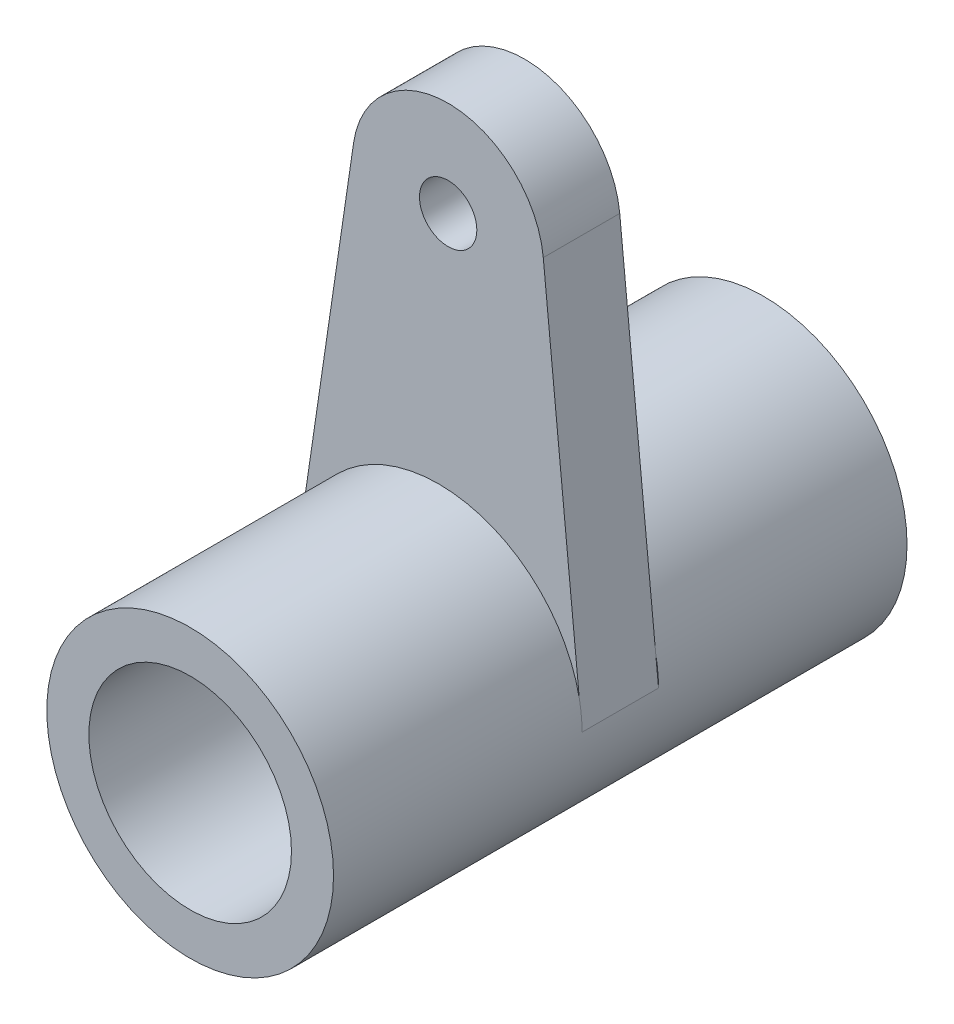
ISO-10303-21;
HEADER;
FILE_DESCRIPTION(('STEP AP214'),'2;1');
FILE_NAME('part.step','',(''),(''),'','','');
FILE_SCHEMA(('AUTOMOTIVE_DESIGN { 1 0 10303 214 1 1 1 1 }'));
ENDSEC;
DATA;
#1=APPLICATION_CONTEXT('core data for automotive mechanical design processes');
#2=APPLICATION_PROTOCOL_DEFINITION('international standard','automotive_design',2000,#1);
#3=PRODUCT_CONTEXT('',#1,'mechanical');
#4=PRODUCT('Part','Part','',(#3));
#5=PRODUCT_RELATED_PRODUCT_CATEGORY('part','',(#4));
#6=PRODUCT_DEFINITION_FORMATION('','',#4);
#7=PRODUCT_DEFINITION_CONTEXT('part definition',#1,'design');
#8=PRODUCT_DEFINITION('design','',#6,#7);
#9=PRODUCT_DEFINITION_SHAPE('','',#8);
#10=(LENGTH_UNIT() NAMED_UNIT(*) SI_UNIT(.MILLI.,.METRE.));
#11=(NAMED_UNIT(*) PLANE_ANGLE_UNIT() SI_UNIT($,.RADIAN.));
#12=(NAMED_UNIT(*) SI_UNIT($,.STERADIAN.) SOLID_ANGLE_UNIT());
#13=UNCERTAINTY_MEASURE_WITH_UNIT(LENGTH_MEASURE(1.E-05),#10,'distance_accuracy_value','');
#14=(GEOMETRIC_REPRESENTATION_CONTEXT(3) GLOBAL_UNCERTAINTY_ASSIGNED_CONTEXT((#13)) GLOBAL_UNIT_ASSIGNED_CONTEXT((#10,
#11,#12)) REPRESENTATION_CONTEXT('',''));
#15=CARTESIAN_POINT('',(0.,0.,0.));
#16=DIRECTION('',(0.,0.,1.));
#17=DIRECTION('',(1.,0.,0.));
#18=AXIS2_PLACEMENT_3D('',#15,#16,#17);
#19=CARTESIAN_POINT('',(0.495729812684115,19.9938553549038,-2.));
#20=DIRECTION('',(0.,0.,1.));
#21=DIRECTION('',(1.,0.,0.));
#22=AXIS2_PLACEMENT_3D('',#19,#20,#21);
#23=CYLINDRICAL_SURFACE('',#22,5.);
#24=DIRECTION('',(0.,0.,1.));
#25=VECTOR('',#24,1.);
#26=CARTESIAN_POINT('',(-4.45100810379043,20.7217179694906,-2.));
#27=LINE('',#26,#25);
#28=CARTESIAN_POINT('',(-4.45100810379043,20.7217179694906,-2.));
#29=VERTEX_POINT('',#28);
#30=CARTESIAN_POINT('',(-4.45100810379043,20.7217179694906,2.));
#31=VERTEX_POINT('',#30);
#32=EDGE_CURVE('E39',#29,#31,#27,.T.);
#33=ORIENTED_EDGE('',*,*,#32,.T.);
#34=CARTESIAN_POINT('',(0.495729812684115,19.9938553549038,2.));
#35=DIRECTION('',(0.,0.,1.));
#36=DIRECTION('',(1.,0.,0.));
#37=AXIS2_PLACEMENT_3D('',#34,#35,#36);
#38=CIRCLE('',#37,5.);
#39=CARTESIAN_POINT('',(5.47139558895946,20.4865521001765,2.));
#40=VERTEX_POINT('',#39);
#41=EDGE_CURVE('E129',#31,#40,#38,.F.);
#42=ORIENTED_EDGE('',*,*,#41,.T.);
#43=DIRECTION('',(0.,0.,1.));
#44=VECTOR('',#43,1.);
#45=CARTESIAN_POINT('',(5.47139558895946,20.4865521001765,-2.));
#46=LINE('',#45,#44);
#47=CARTESIAN_POINT('',(5.47139558895946,20.4865521001765,-2.));
#48=VERTEX_POINT('',#47);
#49=EDGE_CURVE('E147',#48,#40,#46,.T.);
#50=ORIENTED_EDGE('',*,*,#49,.F.);
#51=CARTESIAN_POINT('',(0.495729812684115,19.9938553549038,-2.));
#52=DIRECTION('',(0.,0.,1.));
#53=DIRECTION('',(1.,0.,0.));
#54=AXIS2_PLACEMENT_3D('',#51,#52,#53);
#55=CIRCLE('',#54,5.);
#56=EDGE_CURVE('E142',#29,#48,#55,.F.);
#57=ORIENTED_EDGE('',*,*,#56,.F.);
#58=EDGE_LOOP('',(#33,#42,#50,#57));
#59=FACE_BOUND('',#58,.T.);
#60=ADVANCED_FACE('F35',(#59),#23,.T.);
#61=CARTESIAN_POINT('',(7.42717497515932,0.735448300060621,-2.));
#62=DIRECTION('',(-0.995133155255069,-0.0985393490545311,0.));
#63=DIRECTION('',(0.0985393490545311,-0.995133155255069,0.));
#64=AXIS2_PLACEMENT_3D('',#61,#62,#63);
#65=PLANE('',#64);
#66=ORIENTED_EDGE('',*,*,#49,.T.);
#67=DIRECTION('',(0.0985393490545311,-0.995133155255069,0.));
#68=VECTOR('',#67,1.);
#69=CARTESIAN_POINT('',(7.42717497515932,0.735448300060621,2.));
#70=LINE('',#69,#68);
#71=CARTESIAN_POINT('',(7.35434995031864,1.47089660012123,2.));
#72=VERTEX_POINT('',#71);
#73=EDGE_CURVE('E136',#40,#72,#70,.T.);
#74=ORIENTED_EDGE('',*,*,#73,.T.);
#75=CARTESIAN_POINT('',(7.5,0.,2.));
#76=VERTEX_POINT('',#75);
#77=EDGE_CURVE('E135',#72,#76,#70,.T.);
#78=ORIENTED_EDGE('',*,*,#77,.T.);
#79=DIRECTION('',(0.,0.,1.));
#80=VECTOR('',#79,1.);
#81=CARTESIAN_POINT('',(7.5,0.,-2.));
#82=LINE('',#81,#80);
#83=CARTESIAN_POINT('',(7.5,0.,-2.));
#84=VERTEX_POINT('',#83);
#85=EDGE_CURVE('E108',#84,#76,#82,.T.);
#86=ORIENTED_EDGE('',*,*,#85,.F.);
#87=DIRECTION('',(0.0985393490545311,-0.995133155255069,0.));
#88=VECTOR('',#87,1.);
#89=CARTESIAN_POINT('',(7.42717497515932,0.735448300060621,-2.));
#90=LINE('',#89,#88);
#91=CARTESIAN_POINT('',(7.35434995031864,1.47089660012123,-2.));
#92=VERTEX_POINT('',#91);
#93=EDGE_CURVE('E60',#92,#84,#90,.T.);
#94=ORIENTED_EDGE('',*,*,#93,.F.);
#95=EDGE_CURVE('E145',#48,#92,#90,.T.);
#96=ORIENTED_EDGE('',*,*,#95,.F.);
#97=EDGE_LOOP('',(#66,#74,#78,#86,#94,#96));
#98=FACE_BOUND('',#97,.T.);
#99=ADVANCED_FACE('F152',(#98),#65,.F.);
#100=CARTESIAN_POINT('',(0.,0.,-2.));
#101=DIRECTION('',(0.,0.,1.));
#102=DIRECTION('',(1.,0.,0.));
#103=AXIS2_PLACEMENT_3D('',#100,#101,#102);
#104=CYLINDRICAL_SURFACE('',#103,7.5);
#105=ORIENTED_EDGE('',*,*,#85,.T.);
#106=CARTESIAN_POINT('',(0.,0.,2.));
#107=DIRECTION('',(0.,0.,1.));
#108=DIRECTION('',(1.,0.,0.));
#109=AXIS2_PLACEMENT_3D('',#106,#107,#108);
#110=CIRCLE('',#109,7.5);
#111=EDGE_CURVE('E124',#76,#72,#110,.T.);
#112=ORIENTED_EDGE('',*,*,#111,.T.);
#113=CARTESIAN_POINT('',(-7.18212960857213,2.16032735613645,2.));
#114=VERTEX_POINT('',#113);
#115=EDGE_CURVE('E44',#72,#114,#110,.T.);
#116=ORIENTED_EDGE('',*,*,#115,.T.);
#117=CARTESIAN_POINT('',(-7.5,0.,2.));
#118=VERTEX_POINT('',#117);
#119=EDGE_CURVE('E106',#114,#118,#110,.T.);
#120=ORIENTED_EDGE('',*,*,#119,.T.);
#121=DIRECTION('',(0.,0.,1.));
#122=VECTOR('',#121,1.);
#123=CARTESIAN_POINT('',(-7.5,0.,-2.));
#124=LINE('',#123,#122);
#125=CARTESIAN_POINT('',(-7.5,0.,-2.));
#126=VERTEX_POINT('',#125);
#127=EDGE_CURVE('E94',#126,#118,#124,.T.);
#128=ORIENTED_EDGE('',*,*,#127,.F.);
#129=CARTESIAN_POINT('',(0.,0.,-2.));
#130=DIRECTION('',(0.,0.,1.));
#131=DIRECTION('',(1.,0.,0.));
#132=AXIS2_PLACEMENT_3D('',#129,#130,#131);
#133=CIRCLE('',#132,7.5);
#134=CARTESIAN_POINT('',(-7.18212960857213,2.16032735613645,-2.));
#135=VERTEX_POINT('',#134);
#136=EDGE_CURVE('E47',#135,#126,#133,.T.);
#137=ORIENTED_EDGE('',*,*,#136,.F.);
#138=EDGE_CURVE('E11',#92,#135,#133,.T.);
#139=ORIENTED_EDGE('',*,*,#138,.F.);
#140=EDGE_CURVE('E46',#84,#92,#133,.T.);
#141=ORIENTED_EDGE('',*,*,#140,.F.);
#142=EDGE_LOOP('',(#105,#112,#116,#120,#128,#137,#139,#141));
#143=FACE_BOUND('',#142,.T.);
#144=CARTESIAN_POINT('',(0.,0.,15.));
#145=DIRECTION('',(0.,0.,1.));
#146=DIRECTION('',(1.,0.,0.));
#147=AXIS2_PLACEMENT_3D('',#144,#145,#146);
#148=CIRCLE('',#147,7.5);
#149=CARTESIAN_POINT('',(7.5,0.,15.));
#150=VERTEX_POINT('',#149);
#151=EDGE_CURVE('E120',#150,#150,#148,.T.);
#152=ORIENTED_EDGE('',*,*,#151,.F.);
#153=EDGE_LOOP('',(#152));
#154=FACE_BOUND('',#153,.T.);
#155=CARTESIAN_POINT('',(0.,0.,-15.));
#156=DIRECTION('',(0.,0.,1.));
#157=DIRECTION('',(1.,0.,0.));
#158=AXIS2_PLACEMENT_3D('',#155,#156,#157);
#159=CIRCLE('',#158,7.5);
#160=CARTESIAN_POINT('',(7.5,0.,-15.));
#161=VERTEX_POINT('',#160);
#162=EDGE_CURVE('E112',#161,#161,#159,.T.);
#163=ORIENTED_EDGE('',*,*,#162,.T.);
#164=EDGE_LOOP('',(#163));
#165=FACE_BOUND('',#164,.T.);
#166=ADVANCED_FACE('F103',(#143,#154,#165),#104,.T.);
#167=CARTESIAN_POINT('',(-7.34106480428606,1.08016367806823,-2.));
#168=DIRECTION('',(0.989347583294908,-0.145572522917358,0.));
#169=DIRECTION('',(0.145572522917358,0.989347583294908,0.));
#170=AXIS2_PLACEMENT_3D('',#167,#168,#169);
#171=PLANE('',#170);
#172=ORIENTED_EDGE('',*,*,#127,.T.);
#173=DIRECTION('',(0.145572522917358,0.989347583294908,0.));
#174=VECTOR('',#173,1.);
#175=CARTESIAN_POINT('',(-7.34106480428606,1.08016367806823,2.));
#176=LINE('',#175,#174);
#177=EDGE_CURVE('E133',#118,#114,#176,.T.);
#178=ORIENTED_EDGE('',*,*,#177,.T.);
#179=EDGE_CURVE('E132',#114,#31,#176,.T.);
#180=ORIENTED_EDGE('',*,*,#179,.T.);
#181=ORIENTED_EDGE('',*,*,#32,.F.);
#182=DIRECTION('',(0.145572522917358,0.989347583294908,0.));
#183=VECTOR('',#182,1.);
#184=CARTESIAN_POINT('',(-7.34106480428606,1.08016367806823,-2.));
#185=LINE('',#184,#183);
#186=EDGE_CURVE('E96',#135,#29,#185,.T.);
#187=ORIENTED_EDGE('',*,*,#186,.F.);
#188=EDGE_CURVE('E90',#126,#135,#185,.T.);
#189=ORIENTED_EDGE('',*,*,#188,.F.);
#190=EDGE_LOOP('',(#172,#178,#180,#181,#187,#189));
#191=FACE_BOUND('',#190,.T.);
#192=ADVANCED_FACE('F92',(#191),#171,.F.);
#193=CARTESIAN_POINT('',(0.495729812684115,19.9938553549038,-2.));
#194=DIRECTION('',(0.,0.,1.));
#195=DIRECTION('',(1.,0.,0.));
#196=AXIS2_PLACEMENT_3D('',#193,#194,#195);
#197=CYLINDRICAL_SURFACE('',#196,1.5);
#198=CARTESIAN_POINT('',(0.495729812684115,19.9938553549038,-2.));
#199=DIRECTION('',(0.,0.,1.));
#200=DIRECTION('',(1.,0.,0.));
#201=AXIS2_PLACEMENT_3D('',#198,#199,#200);
#202=CIRCLE('',#201,1.5);
#203=CARTESIAN_POINT('',(1.99572981268412,19.9938553549038,-2.));
#204=VERTEX_POINT('',#203);
#205=EDGE_CURVE('E139',#204,#204,#202,.T.);
#206=ORIENTED_EDGE('',*,*,#205,.F.);
#207=EDGE_LOOP('',(#206));
#208=FACE_BOUND('',#207,.T.);
#209=CARTESIAN_POINT('',(0.495729812684115,19.9938553549038,2.));
#210=DIRECTION('',(0.,0.,1.));
#211=DIRECTION('',(1.,0.,0.));
#212=AXIS2_PLACEMENT_3D('',#209,#210,#211);
#213=CIRCLE('',#212,1.5);
#214=CARTESIAN_POINT('',(1.99572981268412,19.9938553549038,2.));
#215=VERTEX_POINT('',#214);
#216=EDGE_CURVE('E123',#215,#215,#213,.T.);
#217=ORIENTED_EDGE('',*,*,#216,.T.);
#218=EDGE_LOOP('',(#217));
#219=FACE_BOUND('',#218,.T.);
#220=ADVANCED_FACE('F37',(#208,#219),#197,.F.);
#221=CARTESIAN_POINT('',(0.,0.,-2.));
#222=DIRECTION('',(0.,0.,1.));
#223=DIRECTION('',(1.,0.,0.));
#224=AXIS2_PLACEMENT_3D('',#221,#222,#223);
#225=CYLINDRICAL_SURFACE('',#224,5.3);
#226=CARTESIAN_POINT('',(0.,0.,15.));
#227=DIRECTION('',(0.,0.,1.));
#228=DIRECTION('',(1.,0.,0.));
#229=AXIS2_PLACEMENT_3D('',#226,#227,#228);
#230=CIRCLE('',#229,5.3);
#231=CARTESIAN_POINT('',(5.3,0.,15.));
#232=VERTEX_POINT('',#231);
#233=EDGE_CURVE('E117',#232,#232,#230,.T.);
#234=ORIENTED_EDGE('',*,*,#233,.T.);
#235=EDGE_LOOP('',(#234));
#236=FACE_BOUND('',#235,.T.);
#237=CARTESIAN_POINT('',(0.,0.,-15.));
#238=DIRECTION('',(0.,0.,1.));
#239=DIRECTION('',(1.,0.,0.));
#240=AXIS2_PLACEMENT_3D('',#237,#238,#239);
#241=CIRCLE('',#240,5.3);
#242=CARTESIAN_POINT('',(5.3,0.,-15.));
#243=VERTEX_POINT('',#242);
#244=EDGE_CURVE('E110',#243,#243,#241,.T.);
#245=ORIENTED_EDGE('',*,*,#244,.F.);
#246=EDGE_LOOP('',(#245));
#247=FACE_BOUND('',#246,.T.);
#248=ADVANCED_FACE('F181',(#236,#247),#225,.F.);
#249=CARTESIAN_POINT('',(0.,0.,-2.));
#250=DIRECTION('',(0.,0.,1.));
#251=DIRECTION('',(1.,0.,0.));
#252=AXIS2_PLACEMENT_3D('',#249,#250,#251);
#253=PLANE('',#252);
#254=ORIENTED_EDGE('',*,*,#205,.T.);
#255=EDGE_LOOP('',(#254));
#256=FACE_BOUND('',#255,.T.);
#257=ORIENTED_EDGE('',*,*,#95,.T.);
#258=ORIENTED_EDGE('',*,*,#138,.T.);
#259=ORIENTED_EDGE('',*,*,#186,.T.);
#260=ORIENTED_EDGE('',*,*,#56,.T.);
#261=EDGE_LOOP('',(#257,#258,#259,#260));
#262=FACE_BOUND('',#261,.T.);
#263=ADVANCED_FACE('F184',(#256,#262),#253,.F.);
#264=CARTESIAN_POINT('',(0.,0.,2.));
#265=DIRECTION('',(0.,0.,1.));
#266=DIRECTION('',(1.,0.,0.));
#267=AXIS2_PLACEMENT_3D('',#264,#265,#266);
#268=PLANE('',#267);
#269=ORIENTED_EDGE('',*,*,#115,.F.);
#270=ORIENTED_EDGE('',*,*,#73,.F.);
#271=ORIENTED_EDGE('',*,*,#41,.F.);
#272=ORIENTED_EDGE('',*,*,#179,.F.);
#273=EDGE_LOOP('',(#269,#270,#271,#272));
#274=FACE_BOUND('',#273,.T.);
#275=ORIENTED_EDGE('',*,*,#216,.F.);
#276=EDGE_LOOP('',(#275));
#277=FACE_BOUND('',#276,.T.);
#278=ADVANCED_FACE('F188',(#274,#277),#268,.T.);
#279=CARTESIAN_POINT('',(0.,0.,2.));
#280=DIRECTION('',(0.,0.,1.));
#281=DIRECTION('',(1.,0.,0.));
#282=AXIS2_PLACEMENT_3D('',#279,#280,#281);
#283=PLANE('',#282);
#284=ORIENTED_EDGE('',*,*,#177,.F.);
#285=ORIENTED_EDGE('',*,*,#119,.F.);
#286=EDGE_LOOP('',(#284,#285));
#287=FACE_BOUND('',#286,.T.);
#288=ADVANCED_FACE('F166',(#287),#283,.F.);
#289=CARTESIAN_POINT('',(0.,0.,15.));
#290=DIRECTION('',(0.,0.,1.));
#291=DIRECTION('',(1.,0.,0.));
#292=AXIS2_PLACEMENT_3D('',#289,#290,#291);
#293=PLANE('',#292);
#294=ORIENTED_EDGE('',*,*,#151,.T.);
#295=EDGE_LOOP('',(#294));
#296=FACE_BOUND('',#295,.T.);
#297=ORIENTED_EDGE('',*,*,#233,.F.);
#298=EDGE_LOOP('',(#297));
#299=FACE_BOUND('',#298,.T.);
#300=ADVANCED_FACE('F163',(#296,#299),#293,.T.);
#301=ORIENTED_EDGE('',*,*,#77,.F.);
#302=ORIENTED_EDGE('',*,*,#111,.F.);
#303=EDGE_LOOP('',(#301,#302));
#304=FACE_BOUND('',#303,.T.);
#305=ADVANCED_FACE('F156',(#304),#283,.F.);
#306=CARTESIAN_POINT('',(0.,0.,-2.));
#307=DIRECTION('',(0.,0.,-1.));
#308=DIRECTION('',(1.,0.,0.));
#309=AXIS2_PLACEMENT_3D('',#306,#307,#308);
#310=PLANE('',#309);
#311=ORIENTED_EDGE('',*,*,#140,.T.);
#312=ORIENTED_EDGE('',*,*,#93,.T.);
#313=EDGE_LOOP('',(#311,#312));
#314=FACE_BOUND('',#313,.T.);
#315=ADVANCED_FACE('F154',(#314),#310,.F.);
#316=ORIENTED_EDGE('',*,*,#136,.T.);
#317=ORIENTED_EDGE('',*,*,#188,.T.);
#318=EDGE_LOOP('',(#316,#317));
#319=FACE_BOUND('',#318,.T.);
#320=ADVANCED_FACE('F109',(#319),#310,.F.);
#321=CARTESIAN_POINT('',(0.,0.,-15.));
#322=DIRECTION('',(0.,0.,-1.));
#323=DIRECTION('',(1.,0.,0.));
#324=AXIS2_PLACEMENT_3D('',#321,#322,#323);
#325=PLANE('',#324);
#326=ORIENTED_EDGE('',*,*,#244,.T.);
#327=EDGE_LOOP('',(#326));
#328=FACE_BOUND('',#327,.T.);
#329=ORIENTED_EDGE('',*,*,#162,.F.);
#330=EDGE_LOOP('',(#329));
#331=FACE_BOUND('',#330,.T.);
#332=ADVANCED_FACE('F162',(#328,#331),#325,.T.);
#333=CLOSED_SHELL('',(#60,#99,#166,#192,#220,#248,#263,#278,#288,#300,#305,#315,#320,#332));
#334=MANIFOLD_SOLID_BREP('B2',#333);
#335=ADVANCED_BREP_SHAPE_REPRESENTATION('',(#18,#334),#14);
#336=SHAPE_DEFINITION_REPRESENTATION(#9,#335);
ENDSEC;
END-ISO-10303-21;
